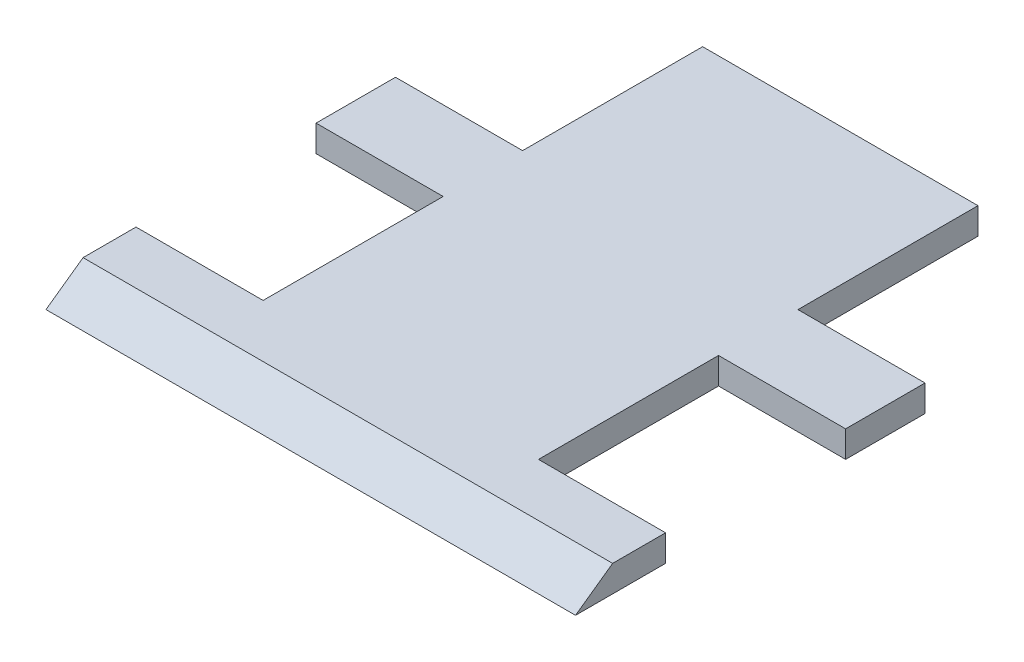
ISO-10303-21;
HEADER;
FILE_DESCRIPTION(('STEP AP214'),'2;1');
FILE_NAME('part.step','',(''),(''),'','','');
FILE_SCHEMA(('AUTOMOTIVE_DESIGN { 1 0 10303 214 1 1 1 1 }'));
ENDSEC;
DATA;
#1=APPLICATION_CONTEXT('core data for automotive mechanical design processes');
#2=APPLICATION_PROTOCOL_DEFINITION('international standard','automotive_design',2000,#1);
#3=PRODUCT_CONTEXT('',#1,'mechanical');
#4=PRODUCT('Part','Part','',(#3));
#5=PRODUCT_RELATED_PRODUCT_CATEGORY('part','',(#4));
#6=PRODUCT_DEFINITION_FORMATION('','',#4);
#7=PRODUCT_DEFINITION_CONTEXT('part definition',#1,'design');
#8=PRODUCT_DEFINITION('design','',#6,#7);
#9=PRODUCT_DEFINITION_SHAPE('','',#8);
#10=(LENGTH_UNIT() NAMED_UNIT(*) SI_UNIT(.MILLI.,.METRE.));
#11=(NAMED_UNIT(*) PLANE_ANGLE_UNIT() SI_UNIT($,.RADIAN.));
#12=(NAMED_UNIT(*) SI_UNIT($,.STERADIAN.) SOLID_ANGLE_UNIT());
#13=UNCERTAINTY_MEASURE_WITH_UNIT(LENGTH_MEASURE(1.E-05),#10,'distance_accuracy_value','');
#14=(GEOMETRIC_REPRESENTATION_CONTEXT(3) GLOBAL_UNCERTAINTY_ASSIGNED_CONTEXT((#13)) GLOBAL_UNIT_ASSIGNED_CONTEXT((#10,
#11,#12)) REPRESENTATION_CONTEXT('',''));
#15=CARTESIAN_POINT('',(0.,0.,0.));
#16=DIRECTION('',(0.,0.,1.));
#17=DIRECTION('',(1.,0.,0.));
#18=AXIS2_PLACEMENT_3D('',#15,#16,#17);
#19=CARTESIAN_POINT('',(0.,5.,43.));
#20=DIRECTION('',(0.,-0.813733471206735,-0.581238193719096));
#21=DIRECTION('',(1.,0.,0.));
#22=AXIS2_PLACEMENT_3D('',#19,#20,#21);
#23=PLANE('',#22);
#24=DIRECTION('',(1.,0.,0.));
#25=VECTOR('',#24,1.);
#26=CARTESIAN_POINT('',(0.,5.,43.));
#27=LINE('',#26,#25);
#28=CARTESIAN_POINT('',(-50.,5.,43.));
#29=VERTEX_POINT('',#28);
#30=CARTESIAN_POINT('',(50.,5.,43.));
#31=VERTEX_POINT('',#30);
#32=EDGE_CURVE('E178',#29,#31,#27,.T.);
#33=ORIENTED_EDGE('',*,*,#32,.F.);
#34=DIRECTION('',(0.,-0.581238193719096,0.813733471206735));
#35=VECTOR('',#34,1.);
#36=CARTESIAN_POINT('',(-50.,5.00000000000001,43.));
#37=LINE('',#36,#35);
#38=CARTESIAN_POINT('',(-50.,0.,50.));
#39=VERTEX_POINT('',#38);
#40=EDGE_CURVE('E49',#39,#29,#37,.F.);
#41=ORIENTED_EDGE('',*,*,#40,.F.);
#42=DIRECTION('',(1.,0.,0.));
#43=VECTOR('',#42,1.);
#44=CARTESIAN_POINT('',(-50.,0.,50.));
#45=LINE('',#44,#43);
#46=CARTESIAN_POINT('',(50.,0.,50.));
#47=VERTEX_POINT('',#46);
#48=EDGE_CURVE('E239',#39,#47,#45,.T.);
#49=ORIENTED_EDGE('',*,*,#48,.T.);
#50=DIRECTION('',(0.,0.581238193719096,-0.813733471206735));
#51=VECTOR('',#50,1.);
#52=CARTESIAN_POINT('',(50.,5.,43.));
#53=LINE('',#52,#51);
#54=EDGE_CURVE('E13',#31,#47,#53,.F.);
#55=ORIENTED_EDGE('',*,*,#54,.F.);
#56=EDGE_LOOP('',(#33,#41,#49,#55));
#57=FACE_BOUND('',#56,.T.);
#58=ADVANCED_FACE('F41',(#57),#23,.F.);
#59=CARTESIAN_POINT('',(-50.,5.,-1.));
#60=DIRECTION('',(0.,0.,-1.));
#61=DIRECTION('',(-1.,0.,0.));
#62=AXIS2_PLACEMENT_3D('',#59,#60,#61);
#63=PLANE('',#62);
#64=DIRECTION('',(1.,0.,0.));
#65=VECTOR('',#64,1.);
#66=CARTESIAN_POINT('',(-50.,0.,-1.));
#67=LINE('',#66,#65);
#68=CARTESIAN_POINT('',(-50.,0.,-1.));
#69=VERTEX_POINT('',#68);
#70=CARTESIAN_POINT('',(-26.,0.,-1.));
#71=VERTEX_POINT('',#70);
#72=EDGE_CURVE('E177',#69,#71,#67,.T.);
#73=ORIENTED_EDGE('',*,*,#72,.T.);
#74=DIRECTION('',(0.,-1.,0.));
#75=VECTOR('',#74,1.);
#76=CARTESIAN_POINT('',(-26.,5.,-1.));
#77=LINE('',#76,#75);
#78=CARTESIAN_POINT('',(-26.,5.,-1.));
#79=VERTEX_POINT('',#78);
#80=EDGE_CURVE('E156',#79,#71,#77,.T.);
#81=ORIENTED_EDGE('',*,*,#80,.F.);
#82=DIRECTION('',(1.,0.,0.));
#83=VECTOR('',#82,1.);
#84=CARTESIAN_POINT('',(-50.,5.,-1.));
#85=LINE('',#84,#83);
#86=CARTESIAN_POINT('',(-50.,5.,-1.));
#87=VERTEX_POINT('',#86);
#88=EDGE_CURVE('E163',#87,#79,#85,.T.);
#89=ORIENTED_EDGE('',*,*,#88,.F.);
#90=DIRECTION('',(0.,-1.,0.));
#91=VECTOR('',#90,1.);
#92=CARTESIAN_POINT('',(-50.,5.,-1.));
#93=LINE('',#92,#91);
#94=EDGE_CURVE('E216',#87,#69,#93,.T.);
#95=ORIENTED_EDGE('',*,*,#94,.T.);
#96=EDGE_LOOP('',(#73,#81,#89,#95));
#97=FACE_BOUND('',#96,.T.);
#98=ADVANCED_FACE('F175',(#97),#63,.F.);
#99=CARTESIAN_POINT('',(-26.,5.,-1.));
#100=DIRECTION('',(1.,0.,0.));
#101=DIRECTION('',(0.,0.,-1.));
#102=AXIS2_PLACEMENT_3D('',#99,#100,#101);
#103=PLANE('',#102);
#104=DIRECTION('',(0.,0.,1.));
#105=VECTOR('',#104,1.);
#106=CARTESIAN_POINT('',(-26.,0.,-1.));
#107=LINE('',#106,#105);
#108=CARTESIAN_POINT('',(-26.,0.,33.));
#109=VERTEX_POINT('',#108);
#110=EDGE_CURVE('E245',#71,#109,#107,.T.);
#111=ORIENTED_EDGE('',*,*,#110,.T.);
#112=DIRECTION('',(0.,-1.,0.));
#113=VECTOR('',#112,1.);
#114=CARTESIAN_POINT('',(-26.,5.,33.));
#115=LINE('',#114,#113);
#116=CARTESIAN_POINT('',(-26.,5.,33.));
#117=VERTEX_POINT('',#116);
#118=EDGE_CURVE('E159',#117,#109,#115,.T.);
#119=ORIENTED_EDGE('',*,*,#118,.F.);
#120=DIRECTION('',(0.,0.,1.));
#121=VECTOR('',#120,1.);
#122=CARTESIAN_POINT('',(-26.,5.,-1.));
#123=LINE('',#122,#121);
#124=EDGE_CURVE('E152',#79,#117,#123,.T.);
#125=ORIENTED_EDGE('',*,*,#124,.F.);
#126=ORIENTED_EDGE('',*,*,#80,.T.);
#127=EDGE_LOOP('',(#111,#119,#125,#126));
#128=FACE_BOUND('',#127,.T.);
#129=ADVANCED_FACE('F154',(#128),#103,.F.);
#130=CARTESIAN_POINT('',(-50.,5.,33.));
#131=DIRECTION('',(0.,0.,1.));
#132=DIRECTION('',(1.,0.,0.));
#133=AXIS2_PLACEMENT_3D('',#130,#131,#132);
#134=PLANE('',#133);
#135=DIRECTION('',(-1.,0.,0.));
#136=VECTOR('',#135,1.);
#137=CARTESIAN_POINT('',(-50.,0.,33.));
#138=LINE('',#137,#136);
#139=CARTESIAN_POINT('',(-50.,0.,33.));
#140=VERTEX_POINT('',#139);
#141=EDGE_CURVE('E243',#109,#140,#138,.T.);
#142=ORIENTED_EDGE('',*,*,#141,.T.);
#143=DIRECTION('',(0.,-1.,0.));
#144=VECTOR('',#143,1.);
#145=CARTESIAN_POINT('',(-50.,5.,33.));
#146=LINE('',#145,#144);
#147=CARTESIAN_POINT('',(-50.,5.,33.));
#148=VERTEX_POINT('',#147);
#149=EDGE_CURVE('E181',#148,#140,#146,.T.);
#150=ORIENTED_EDGE('',*,*,#149,.F.);
#151=DIRECTION('',(-1.,0.,0.));
#152=VECTOR('',#151,1.);
#153=CARTESIAN_POINT('',(-50.,5.,33.));
#154=LINE('',#153,#152);
#155=EDGE_CURVE('E162',#117,#148,#154,.T.);
#156=ORIENTED_EDGE('',*,*,#155,.F.);
#157=ORIENTED_EDGE('',*,*,#118,.T.);
#158=EDGE_LOOP('',(#142,#150,#156,#157));
#159=FACE_BOUND('',#158,.T.);
#160=ADVANCED_FACE('F273',(#159),#134,.F.);
#161=CARTESIAN_POINT('',(-50.,5.,50.));
#162=DIRECTION('',(1.,0.,0.));
#163=DIRECTION('',(0.,0.,-1.));
#164=AXIS2_PLACEMENT_3D('',#161,#162,#163);
#165=PLANE('',#164);
#166=DIRECTION('',(0.,0.,1.));
#167=VECTOR('',#166,1.);
#168=CARTESIAN_POINT('',(-50.,0.,50.));
#169=LINE('',#168,#167);
#170=EDGE_CURVE('E241',#140,#39,#169,.T.);
#171=ORIENTED_EDGE('',*,*,#170,.T.);
#172=ORIENTED_EDGE('',*,*,#40,.T.);
#173=DIRECTION('',(0.,0.,1.));
#174=VECTOR('',#173,1.);
#175=CARTESIAN_POINT('',(-50.,5.,50.));
#176=LINE('',#175,#174);
#177=EDGE_CURVE('E269',#148,#29,#176,.T.);
#178=ORIENTED_EDGE('',*,*,#177,.F.);
#179=ORIENTED_EDGE('',*,*,#149,.T.);
#180=EDGE_LOOP('',(#171,#172,#178,#179));
#181=FACE_BOUND('',#180,.T.);
#182=ADVANCED_FACE('F276',(#181),#165,.F.);
#183=CARTESIAN_POINT('',(50.,5.,50.));
#184=DIRECTION('',(-1.,0.,0.));
#185=DIRECTION('',(0.,0.,1.));
#186=AXIS2_PLACEMENT_3D('',#183,#184,#185);
#187=PLANE('',#186);
#188=DIRECTION('',(0.,0.,-1.));
#189=VECTOR('',#188,1.);
#190=CARTESIAN_POINT('',(50.,5.,50.));
#191=LINE('',#190,#189);
#192=CARTESIAN_POINT('',(50.,5.,33.));
#193=VERTEX_POINT('',#192);
#194=EDGE_CURVE('E267',#31,#193,#191,.T.);
#195=ORIENTED_EDGE('',*,*,#194,.F.);
#196=ORIENTED_EDGE('',*,*,#54,.T.);
#197=DIRECTION('',(0.,0.,-1.));
#198=VECTOR('',#197,1.);
#199=CARTESIAN_POINT('',(50.,0.,50.));
#200=LINE('',#199,#198);
#201=CARTESIAN_POINT('',(50.,0.,33.));
#202=VERTEX_POINT('',#201);
#203=EDGE_CURVE('E237',#47,#202,#200,.T.);
#204=ORIENTED_EDGE('',*,*,#203,.T.);
#205=DIRECTION('',(0.,-1.,0.));
#206=VECTOR('',#205,1.);
#207=CARTESIAN_POINT('',(50.,5.,33.));
#208=LINE('',#207,#206);
#209=EDGE_CURVE('E186',#193,#202,#208,.T.);
#210=ORIENTED_EDGE('',*,*,#209,.F.);
#211=EDGE_LOOP('',(#195,#196,#204,#210));
#212=FACE_BOUND('',#211,.T.);
#213=ADVANCED_FACE('F279',(#212),#187,.F.);
#214=CARTESIAN_POINT('',(50.,5.,33.));
#215=DIRECTION('',(0.,0.,1.));
#216=DIRECTION('',(1.,0.,0.));
#217=AXIS2_PLACEMENT_3D('',#214,#215,#216);
#218=PLANE('',#217);
#219=DIRECTION('',(-1.,0.,0.));
#220=VECTOR('',#219,1.);
#221=CARTESIAN_POINT('',(50.,0.,33.));
#222=LINE('',#221,#220);
#223=CARTESIAN_POINT('',(26.,0.,33.));
#224=VERTEX_POINT('',#223);
#225=EDGE_CURVE('E235',#202,#224,#222,.T.);
#226=ORIENTED_EDGE('',*,*,#225,.T.);
#227=DIRECTION('',(0.,-1.,0.));
#228=VECTOR('',#227,1.);
#229=CARTESIAN_POINT('',(26.,5.,33.));
#230=LINE('',#229,#228);
#231=CARTESIAN_POINT('',(26.,5.,33.));
#232=VERTEX_POINT('',#231);
#233=EDGE_CURVE('E189',#232,#224,#230,.T.);
#234=ORIENTED_EDGE('',*,*,#233,.F.);
#235=DIRECTION('',(-1.,0.,0.));
#236=VECTOR('',#235,1.);
#237=CARTESIAN_POINT('',(50.,5.,33.));
#238=LINE('',#237,#236);
#239=EDGE_CURVE('E265',#193,#232,#238,.T.);
#240=ORIENTED_EDGE('',*,*,#239,.F.);
#241=ORIENTED_EDGE('',*,*,#209,.T.);
#242=EDGE_LOOP('',(#226,#234,#240,#241));
#243=FACE_BOUND('',#242,.T.);
#244=ADVANCED_FACE('F285',(#243),#218,.F.);
#245=CARTESIAN_POINT('',(26.,5.,-1.00000000000001));
#246=DIRECTION('',(-1.,0.,0.));
#247=DIRECTION('',(0.,0.,1.));
#248=AXIS2_PLACEMENT_3D('',#245,#246,#247);
#249=PLANE('',#248);
#250=DIRECTION('',(0.,0.,-1.));
#251=VECTOR('',#250,1.);
#252=CARTESIAN_POINT('',(26.,0.,-1.00000000000001));
#253=LINE('',#252,#251);
#254=CARTESIAN_POINT('',(26.,0.,-1.00000000000001));
#255=VERTEX_POINT('',#254);
#256=EDGE_CURVE('E233',#224,#255,#253,.T.);
#257=ORIENTED_EDGE('',*,*,#256,.T.);
#258=DIRECTION('',(0.,-1.,0.));
#259=VECTOR('',#258,1.);
#260=CARTESIAN_POINT('',(26.,5.,-1.00000000000001));
#261=LINE('',#260,#259);
#262=CARTESIAN_POINT('',(26.,5.,-1.00000000000001));
#263=VERTEX_POINT('',#262);
#264=EDGE_CURVE('E192',#263,#255,#261,.T.);
#265=ORIENTED_EDGE('',*,*,#264,.F.);
#266=DIRECTION('',(0.,0.,-1.));
#267=VECTOR('',#266,1.);
#268=CARTESIAN_POINT('',(26.,5.,-1.00000000000001));
#269=LINE('',#268,#267);
#270=EDGE_CURVE('E263',#232,#263,#269,.T.);
#271=ORIENTED_EDGE('',*,*,#270,.F.);
#272=ORIENTED_EDGE('',*,*,#233,.T.);
#273=EDGE_LOOP('',(#257,#265,#271,#272));
#274=FACE_BOUND('',#273,.T.);
#275=ADVANCED_FACE('F305',(#274),#249,.F.);
#276=CARTESIAN_POINT('',(50.,5.,-1.00000000000001));
#277=DIRECTION('',(0.,0.,-1.));
#278=DIRECTION('',(-1.,0.,0.));
#279=AXIS2_PLACEMENT_3D('',#276,#277,#278);
#280=PLANE('',#279);
#281=DIRECTION('',(1.,0.,0.));
#282=VECTOR('',#281,1.);
#283=CARTESIAN_POINT('',(50.,0.,-1.00000000000001));
#284=LINE('',#283,#282);
#285=CARTESIAN_POINT('',(50.,0.,-1.00000000000001));
#286=VERTEX_POINT('',#285);
#287=EDGE_CURVE('E231',#255,#286,#284,.T.);
#288=ORIENTED_EDGE('',*,*,#287,.T.);
#289=DIRECTION('',(0.,-1.,0.));
#290=VECTOR('',#289,1.);
#291=CARTESIAN_POINT('',(50.,5.,-1.00000000000001));
#292=LINE('',#291,#290);
#293=CARTESIAN_POINT('',(50.,5.,-1.00000000000001));
#294=VERTEX_POINT('',#293);
#295=EDGE_CURVE('E195',#294,#286,#292,.T.);
#296=ORIENTED_EDGE('',*,*,#295,.F.);
#297=DIRECTION('',(1.,0.,0.));
#298=VECTOR('',#297,1.);
#299=CARTESIAN_POINT('',(50.,5.,-1.00000000000001));
#300=LINE('',#299,#298);
#301=EDGE_CURVE('E261',#263,#294,#300,.T.);
#302=ORIENTED_EDGE('',*,*,#301,.F.);
#303=ORIENTED_EDGE('',*,*,#264,.T.);
#304=EDGE_LOOP('',(#288,#296,#302,#303));
#305=FACE_BOUND('',#304,.T.);
#306=ADVANCED_FACE('F309',(#305),#280,.F.);
#307=CARTESIAN_POINT('',(50.,5.,-1.00000000000001));
#308=DIRECTION('',(-1.,0.,0.));
#309=DIRECTION('',(0.,0.,1.));
#310=AXIS2_PLACEMENT_3D('',#307,#308,#309);
#311=PLANE('',#310);
#312=DIRECTION('',(0.,0.,-1.));
#313=VECTOR('',#312,1.);
#314=CARTESIAN_POINT('',(50.,0.,-1.00000000000001));
#315=LINE('',#314,#313);
#316=CARTESIAN_POINT('',(50.,0.,-16.));
#317=VERTEX_POINT('',#316);
#318=EDGE_CURVE('E229',#286,#317,#315,.T.);
#319=ORIENTED_EDGE('',*,*,#318,.T.);
#320=DIRECTION('',(0.,-1.,0.));
#321=VECTOR('',#320,1.);
#322=CARTESIAN_POINT('',(50.,5.,-16.));
#323=LINE('',#322,#321);
#324=CARTESIAN_POINT('',(50.,5.,-16.));
#325=VERTEX_POINT('',#324);
#326=EDGE_CURVE('E198',#325,#317,#323,.T.);
#327=ORIENTED_EDGE('',*,*,#326,.F.);
#328=DIRECTION('',(0.,0.,-1.));
#329=VECTOR('',#328,1.);
#330=CARTESIAN_POINT('',(50.,5.,-1.00000000000001));
#331=LINE('',#330,#329);
#332=EDGE_CURVE('E259',#294,#325,#331,.T.);
#333=ORIENTED_EDGE('',*,*,#332,.F.);
#334=ORIENTED_EDGE('',*,*,#295,.T.);
#335=EDGE_LOOP('',(#319,#327,#333,#334));
#336=FACE_BOUND('',#335,.T.);
#337=ADVANCED_FACE('F314',(#336),#311,.F.);
#338=CARTESIAN_POINT('',(50.,5.,-16.));
#339=DIRECTION('',(0.,0.,1.));
#340=DIRECTION('',(1.,0.,0.));
#341=AXIS2_PLACEMENT_3D('',#338,#339,#340);
#342=PLANE('',#341);
#343=DIRECTION('',(-1.,0.,0.));
#344=VECTOR('',#343,1.);
#345=CARTESIAN_POINT('',(50.,0.,-16.));
#346=LINE('',#345,#344);
#347=CARTESIAN_POINT('',(26.,0.,-16.));
#348=VERTEX_POINT('',#347);
#349=EDGE_CURVE('E227',#317,#348,#346,.T.);
#350=ORIENTED_EDGE('',*,*,#349,.T.);
#351=DIRECTION('',(0.,-1.,0.));
#352=VECTOR('',#351,1.);
#353=CARTESIAN_POINT('',(26.,5.,-16.));
#354=LINE('',#353,#352);
#355=CARTESIAN_POINT('',(26.,5.,-16.));
#356=VERTEX_POINT('',#355);
#357=EDGE_CURVE('E201',#356,#348,#354,.T.);
#358=ORIENTED_EDGE('',*,*,#357,.F.);
#359=DIRECTION('',(-1.,0.,0.));
#360=VECTOR('',#359,1.);
#361=CARTESIAN_POINT('',(50.,5.,-16.));
#362=LINE('',#361,#360);
#363=EDGE_CURVE('E257',#325,#356,#362,.T.);
#364=ORIENTED_EDGE('',*,*,#363,.F.);
#365=ORIENTED_EDGE('',*,*,#326,.T.);
#366=EDGE_LOOP('',(#350,#358,#364,#365));
#367=FACE_BOUND('',#366,.T.);
#368=ADVANCED_FACE('F320',(#367),#342,.F.);
#369=CARTESIAN_POINT('',(26.,5.,-50.));
#370=DIRECTION('',(-1.,0.,0.));
#371=DIRECTION('',(0.,0.,1.));
#372=AXIS2_PLACEMENT_3D('',#369,#370,#371);
#373=PLANE('',#372);
#374=DIRECTION('',(0.,0.,-1.));
#375=VECTOR('',#374,1.);
#376=CARTESIAN_POINT('',(26.,0.,-50.));
#377=LINE('',#376,#375);
#378=CARTESIAN_POINT('',(26.,0.,-50.));
#379=VERTEX_POINT('',#378);
#380=EDGE_CURVE('E225',#348,#379,#377,.T.);
#381=ORIENTED_EDGE('',*,*,#380,.T.);
#382=DIRECTION('',(0.,-1.,0.));
#383=VECTOR('',#382,1.);
#384=CARTESIAN_POINT('',(26.,5.,-50.));
#385=LINE('',#384,#383);
#386=CARTESIAN_POINT('',(26.,5.,-50.));
#387=VERTEX_POINT('',#386);
#388=EDGE_CURVE('E204',#387,#379,#385,.T.);
#389=ORIENTED_EDGE('',*,*,#388,.F.);
#390=DIRECTION('',(0.,0.,-1.));
#391=VECTOR('',#390,1.);
#392=CARTESIAN_POINT('',(26.,5.,-50.));
#393=LINE('',#392,#391);
#394=EDGE_CURVE('E255',#356,#387,#393,.T.);
#395=ORIENTED_EDGE('',*,*,#394,.F.);
#396=ORIENTED_EDGE('',*,*,#357,.T.);
#397=EDGE_LOOP('',(#381,#389,#395,#396));
#398=FACE_BOUND('',#397,.T.);
#399=ADVANCED_FACE('F324',(#398),#373,.F.);
#400=CARTESIAN_POINT('',(-26.,5.,-50.));
#401=DIRECTION('',(0.,0.,1.));
#402=DIRECTION('',(1.,0.,0.));
#403=AXIS2_PLACEMENT_3D('',#400,#401,#402);
#404=PLANE('',#403);
#405=DIRECTION('',(-1.,0.,0.));
#406=VECTOR('',#405,1.);
#407=CARTESIAN_POINT('',(-26.,0.,-50.));
#408=LINE('',#407,#406);
#409=CARTESIAN_POINT('',(-26.,0.,-50.));
#410=VERTEX_POINT('',#409);
#411=EDGE_CURVE('E223',#379,#410,#408,.T.);
#412=ORIENTED_EDGE('',*,*,#411,.T.);
#413=DIRECTION('',(0.,-1.,0.));
#414=VECTOR('',#413,1.);
#415=CARTESIAN_POINT('',(-26.,5.,-50.));
#416=LINE('',#415,#414);
#417=CARTESIAN_POINT('',(-26.,5.,-50.));
#418=VERTEX_POINT('',#417);
#419=EDGE_CURVE('E207',#418,#410,#416,.T.);
#420=ORIENTED_EDGE('',*,*,#419,.F.);
#421=DIRECTION('',(-1.,0.,0.));
#422=VECTOR('',#421,1.);
#423=CARTESIAN_POINT('',(-26.,5.,-50.));
#424=LINE('',#423,#422);
#425=EDGE_CURVE('E253',#387,#418,#424,.T.);
#426=ORIENTED_EDGE('',*,*,#425,.F.);
#427=ORIENTED_EDGE('',*,*,#388,.T.);
#428=EDGE_LOOP('',(#412,#420,#426,#427));
#429=FACE_BOUND('',#428,.T.);
#430=ADVANCED_FACE('F329',(#429),#404,.F.);
#431=CARTESIAN_POINT('',(-26.,5.,-50.));
#432=DIRECTION('',(1.,0.,0.));
#433=DIRECTION('',(0.,0.,-1.));
#434=AXIS2_PLACEMENT_3D('',#431,#432,#433);
#435=PLANE('',#434);
#436=DIRECTION('',(0.,0.,1.));
#437=VECTOR('',#436,1.);
#438=CARTESIAN_POINT('',(-26.,0.,-50.));
#439=LINE('',#438,#437);
#440=CARTESIAN_POINT('',(-26.,0.,-16.));
#441=VERTEX_POINT('',#440);
#442=EDGE_CURVE('E221',#410,#441,#439,.T.);
#443=ORIENTED_EDGE('',*,*,#442,.T.);
#444=DIRECTION('',(0.,-1.,0.));
#445=VECTOR('',#444,1.);
#446=CARTESIAN_POINT('',(-26.,5.,-16.));
#447=LINE('',#446,#445);
#448=CARTESIAN_POINT('',(-26.,5.,-16.));
#449=VERTEX_POINT('',#448);
#450=EDGE_CURVE('E210',#449,#441,#447,.T.);
#451=ORIENTED_EDGE('',*,*,#450,.F.);
#452=DIRECTION('',(0.,0.,1.));
#453=VECTOR('',#452,1.);
#454=CARTESIAN_POINT('',(-26.,5.,-50.));
#455=LINE('',#454,#453);
#456=EDGE_CURVE('E251',#418,#449,#455,.T.);
#457=ORIENTED_EDGE('',*,*,#456,.F.);
#458=ORIENTED_EDGE('',*,*,#419,.T.);
#459=EDGE_LOOP('',(#443,#451,#457,#458));
#460=FACE_BOUND('',#459,.T.);
#461=ADVANCED_FACE('F335',(#460),#435,.F.);
#462=CARTESIAN_POINT('',(-50.,5.,-16.));
#463=DIRECTION('',(0.,0.,1.));
#464=DIRECTION('',(1.,0.,0.));
#465=AXIS2_PLACEMENT_3D('',#462,#463,#464);
#466=PLANE('',#465);
#467=DIRECTION('',(-1.,0.,0.));
#468=VECTOR('',#467,1.);
#469=CARTESIAN_POINT('',(-50.,0.,-16.));
#470=LINE('',#469,#468);
#471=CARTESIAN_POINT('',(-50.,0.,-16.));
#472=VERTEX_POINT('',#471);
#473=EDGE_CURVE('E219',#441,#472,#470,.T.);
#474=ORIENTED_EDGE('',*,*,#473,.T.);
#475=DIRECTION('',(0.,-1.,0.));
#476=VECTOR('',#475,1.);
#477=CARTESIAN_POINT('',(-50.,5.,-16.));
#478=LINE('',#477,#476);
#479=CARTESIAN_POINT('',(-50.,5.,-16.));
#480=VERTEX_POINT('',#479);
#481=EDGE_CURVE('E213',#480,#472,#478,.T.);
#482=ORIENTED_EDGE('',*,*,#481,.F.);
#483=DIRECTION('',(-1.,0.,0.));
#484=VECTOR('',#483,1.);
#485=CARTESIAN_POINT('',(-50.,5.,-16.));
#486=LINE('',#485,#484);
#487=EDGE_CURVE('E249',#449,#480,#486,.T.);
#488=ORIENTED_EDGE('',*,*,#487,.F.);
#489=ORIENTED_EDGE('',*,*,#450,.T.);
#490=EDGE_LOOP('',(#474,#482,#488,#489));
#491=FACE_BOUND('',#490,.T.);
#492=ADVANCED_FACE('F339',(#491),#466,.F.);
#493=CARTESIAN_POINT('',(-50.,5.,-1.));
#494=DIRECTION('',(1.,0.,0.));
#495=DIRECTION('',(0.,0.,-1.));
#496=AXIS2_PLACEMENT_3D('',#493,#494,#495);
#497=PLANE('',#496);
#498=DIRECTION('',(0.,0.,1.));
#499=VECTOR('',#498,1.);
#500=CARTESIAN_POINT('',(-50.,0.,-1.));
#501=LINE('',#500,#499);
#502=EDGE_CURVE('E173',#472,#69,#501,.T.);
#503=ORIENTED_EDGE('',*,*,#502,.T.);
#504=ORIENTED_EDGE('',*,*,#94,.F.);
#505=DIRECTION('',(0.,0.,1.));
#506=VECTOR('',#505,1.);
#507=CARTESIAN_POINT('',(-50.,5.,-1.));
#508=LINE('',#507,#506);
#509=EDGE_CURVE('E169',#480,#87,#508,.T.);
#510=ORIENTED_EDGE('',*,*,#509,.F.);
#511=ORIENTED_EDGE('',*,*,#481,.T.);
#512=EDGE_LOOP('',(#503,#504,#510,#511));
#513=FACE_BOUND('',#512,.T.);
#514=ADVANCED_FACE('F342',(#513),#497,.F.);
#515=CARTESIAN_POINT('',(0.,5.,0.));
#516=DIRECTION('',(0.,-1.,0.));
#517=DIRECTION('',(0.,0.,-1.));
#518=AXIS2_PLACEMENT_3D('',#515,#516,#517);
#519=PLANE('',#518);
#520=ORIENTED_EDGE('',*,*,#177,.T.);
#521=ORIENTED_EDGE('',*,*,#32,.T.);
#522=ORIENTED_EDGE('',*,*,#194,.T.);
#523=ORIENTED_EDGE('',*,*,#239,.T.);
#524=ORIENTED_EDGE('',*,*,#270,.T.);
#525=ORIENTED_EDGE('',*,*,#301,.T.);
#526=ORIENTED_EDGE('',*,*,#332,.T.);
#527=ORIENTED_EDGE('',*,*,#363,.T.);
#528=ORIENTED_EDGE('',*,*,#394,.T.);
#529=ORIENTED_EDGE('',*,*,#425,.T.);
#530=ORIENTED_EDGE('',*,*,#456,.T.);
#531=ORIENTED_EDGE('',*,*,#487,.T.);
#532=ORIENTED_EDGE('',*,*,#509,.T.);
#533=ORIENTED_EDGE('',*,*,#88,.T.);
#534=ORIENTED_EDGE('',*,*,#124,.T.);
#535=ORIENTED_EDGE('',*,*,#155,.T.);
#536=EDGE_LOOP('',(#520,#521,#522,#523,#524,#525,#526,#527,#528,#529,#530,#531,#532,#533,#534,#535));
#537=FACE_BOUND('',#536,.T.);
#538=ADVANCED_FACE('F167',(#537),#519,.F.);
#539=CARTESIAN_POINT('',(0.,0.,0.));
#540=DIRECTION('',(0.,-1.,0.));
#541=DIRECTION('',(0.,0.,-1.));
#542=AXIS2_PLACEMENT_3D('',#539,#540,#541);
#543=PLANE('',#542);
#544=ORIENTED_EDGE('',*,*,#72,.F.);
#545=ORIENTED_EDGE('',*,*,#502,.F.);
#546=ORIENTED_EDGE('',*,*,#473,.F.);
#547=ORIENTED_EDGE('',*,*,#442,.F.);
#548=ORIENTED_EDGE('',*,*,#411,.F.);
#549=ORIENTED_EDGE('',*,*,#380,.F.);
#550=ORIENTED_EDGE('',*,*,#349,.F.);
#551=ORIENTED_EDGE('',*,*,#318,.F.);
#552=ORIENTED_EDGE('',*,*,#287,.F.);
#553=ORIENTED_EDGE('',*,*,#256,.F.);
#554=ORIENTED_EDGE('',*,*,#225,.F.);
#555=ORIENTED_EDGE('',*,*,#203,.F.);
#556=ORIENTED_EDGE('',*,*,#48,.F.);
#557=ORIENTED_EDGE('',*,*,#170,.F.);
#558=ORIENTED_EDGE('',*,*,#141,.F.);
#559=ORIENTED_EDGE('',*,*,#110,.F.);
#560=EDGE_LOOP('',(#544,#545,#546,#547,#548,#549,#550,#551,#552,#553,#554,#555,#556,#557,#558,#559));
#561=FACE_BOUND('',#560,.T.);
#562=ADVANCED_FACE('F344',(#561),#543,.T.);
#563=CLOSED_SHELL('',(#58,#98,#129,#160,#182,#213,#244,#275,#306,#337,#368,#399,#430,#461,#492,
#514,#538,#562));
#564=MANIFOLD_SOLID_BREP('B2',#563);
#565=ADVANCED_BREP_SHAPE_REPRESENTATION('',(#18,#564),#14);
#566=SHAPE_DEFINITION_REPRESENTATION(#9,#565);
ENDSEC;
END-ISO-10303-21;
